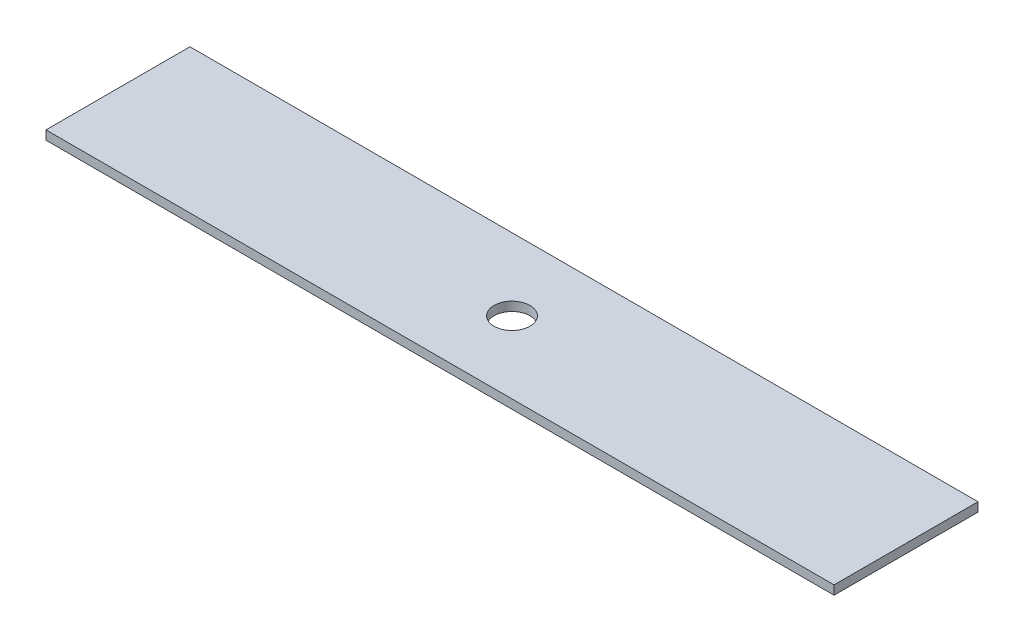
ISO-10303-21;
HEADER;
FILE_DESCRIPTION(('STEP AP214'),'2;1');
FILE_NAME('part.step','',(''),(''),'','','');
FILE_SCHEMA(('AUTOMOTIVE_DESIGN { 1 0 10303 214 1 1 1 1 }'));
ENDSEC;
DATA;
#1=APPLICATION_CONTEXT('core data for automotive mechanical design processes');
#2=APPLICATION_PROTOCOL_DEFINITION('international standard','automotive_design',2000,#1);
#3=PRODUCT_CONTEXT('',#1,'mechanical');
#4=PRODUCT('Part','Part','',(#3));
#5=PRODUCT_RELATED_PRODUCT_CATEGORY('part','',(#4));
#6=PRODUCT_DEFINITION_FORMATION('','',#4);
#7=PRODUCT_DEFINITION_CONTEXT('part definition',#1,'design');
#8=PRODUCT_DEFINITION('design','',#6,#7);
#9=PRODUCT_DEFINITION_SHAPE('','',#8);
#10=(LENGTH_UNIT() NAMED_UNIT(*) SI_UNIT(.MILLI.,.METRE.));
#11=(NAMED_UNIT(*) PLANE_ANGLE_UNIT() SI_UNIT($,.RADIAN.));
#12=(NAMED_UNIT(*) SI_UNIT($,.STERADIAN.) SOLID_ANGLE_UNIT());
#13=UNCERTAINTY_MEASURE_WITH_UNIT(LENGTH_MEASURE(1.E-05),#10,'distance_accuracy_value','');
#14=(GEOMETRIC_REPRESENTATION_CONTEXT(3) GLOBAL_UNCERTAINTY_ASSIGNED_CONTEXT((#13)) GLOBAL_UNIT_ASSIGNED_CONTEXT((#10,
#11,#12)) REPRESENTATION_CONTEXT('',''));
#15=CARTESIAN_POINT('',(0.,0.,0.));
#16=DIRECTION('',(0.,0.,1.));
#17=DIRECTION('',(1.,0.,0.));
#18=AXIS2_PLACEMENT_3D('',#15,#16,#17);
#19=CARTESIAN_POINT('',(139.065,3.175,-25.4));
#20=DIRECTION('',(-1.,0.,0.));
#21=DIRECTION('',(0.,0.,1.));
#22=AXIS2_PLACEMENT_3D('',#19,#20,#21);
#23=PLANE('',#22);
#24=DIRECTION('',(0.,0.,-1.));
#25=VECTOR('',#24,1.);
#26=CARTESIAN_POINT('',(139.065,0.,-25.4));
#27=LINE('',#26,#25);
#28=CARTESIAN_POINT('',(139.065,0.,25.4));
#29=VERTEX_POINT('',#28);
#30=CARTESIAN_POINT('',(139.065,0.,-25.4));
#31=VERTEX_POINT('',#30);
#32=EDGE_CURVE('E96',#29,#31,#27,.T.);
#33=ORIENTED_EDGE('',*,*,#32,.T.);
#34=DIRECTION('',(0.,-1.,0.));
#35=VECTOR('',#34,1.);
#36=CARTESIAN_POINT('',(139.065,3.175,-25.4));
#37=LINE('',#36,#35);
#38=CARTESIAN_POINT('',(139.065,3.175,-25.4));
#39=VERTEX_POINT('',#38);
#40=EDGE_CURVE('E11',#39,#31,#37,.T.);
#41=ORIENTED_EDGE('',*,*,#40,.F.);
#42=DIRECTION('',(0.,0.,-1.));
#43=VECTOR('',#42,1.);
#44=CARTESIAN_POINT('',(139.065,3.175,-25.4));
#45=LINE('',#44,#43);
#46=CARTESIAN_POINT('',(139.065,3.175,25.4));
#47=VERTEX_POINT('',#46);
#48=EDGE_CURVE('E84',#47,#39,#45,.T.);
#49=ORIENTED_EDGE('',*,*,#48,.F.);
#50=DIRECTION('',(0.,-1.,0.));
#51=VECTOR('',#50,1.);
#52=CARTESIAN_POINT('',(139.065,3.175,25.4));
#53=LINE('',#52,#51);
#54=EDGE_CURVE('E92',#47,#29,#53,.T.);
#55=ORIENTED_EDGE('',*,*,#54,.T.);
#56=EDGE_LOOP('',(#33,#41,#49,#55));
#57=FACE_BOUND('',#56,.T.);
#58=ADVANCED_FACE('F33',(#57),#23,.F.);
#59=CARTESIAN_POINT('',(-139.065,3.175,-25.4));
#60=DIRECTION('',(0.,0.,1.));
#61=DIRECTION('',(1.,0.,0.));
#62=AXIS2_PLACEMENT_3D('',#59,#60,#61);
#63=PLANE('',#62);
#64=DIRECTION('',(-1.,0.,0.));
#65=VECTOR('',#64,1.);
#66=CARTESIAN_POINT('',(-139.065,0.,-25.4));
#67=LINE('',#66,#65);
#68=CARTESIAN_POINT('',(-139.065,0.,-25.4));
#69=VERTEX_POINT('',#68);
#70=EDGE_CURVE('E88',#31,#69,#67,.T.);
#71=ORIENTED_EDGE('',*,*,#70,.T.);
#72=DIRECTION('',(0.,-1.,0.));
#73=VECTOR('',#72,1.);
#74=CARTESIAN_POINT('',(-139.065,3.175,-25.4));
#75=LINE('',#74,#73);
#76=CARTESIAN_POINT('',(-139.065,3.175,-25.4));
#77=VERTEX_POINT('',#76);
#78=EDGE_CURVE('E41',#77,#69,#75,.T.);
#79=ORIENTED_EDGE('',*,*,#78,.F.);
#80=DIRECTION('',(-1.,0.,0.));
#81=VECTOR('',#80,1.);
#82=CARTESIAN_POINT('',(-139.065,3.175,-25.4));
#83=LINE('',#82,#81);
#84=EDGE_CURVE('E79',#39,#77,#83,.T.);
#85=ORIENTED_EDGE('',*,*,#84,.F.);
#86=ORIENTED_EDGE('',*,*,#40,.T.);
#87=EDGE_LOOP('',(#71,#79,#85,#86));
#88=FACE_BOUND('',#87,.T.);
#89=ADVANCED_FACE('F87',(#88),#63,.F.);
#90=CARTESIAN_POINT('',(-139.065,3.175,-25.4));
#91=DIRECTION('',(1.,0.,0.));
#92=DIRECTION('',(0.,0.,-1.));
#93=AXIS2_PLACEMENT_3D('',#90,#91,#92);
#94=PLANE('',#93);
#95=DIRECTION('',(0.,0.,1.));
#96=VECTOR('',#95,1.);
#97=CARTESIAN_POINT('',(-139.065,0.,-25.4));
#98=LINE('',#97,#96);
#99=CARTESIAN_POINT('',(-139.065,0.,25.4));
#100=VERTEX_POINT('',#99);
#101=EDGE_CURVE('E66',#69,#100,#98,.T.);
#102=ORIENTED_EDGE('',*,*,#101,.T.);
#103=DIRECTION('',(0.,-1.,0.));
#104=VECTOR('',#103,1.);
#105=CARTESIAN_POINT('',(-139.065,3.175,25.4));
#106=LINE('',#105,#104);
#107=CARTESIAN_POINT('',(-139.065,3.175,25.4));
#108=VERTEX_POINT('',#107);
#109=EDGE_CURVE('E89',#108,#100,#106,.T.);
#110=ORIENTED_EDGE('',*,*,#109,.F.);
#111=DIRECTION('',(0.,0.,1.));
#112=VECTOR('',#111,1.);
#113=CARTESIAN_POINT('',(-139.065,3.175,-25.4));
#114=LINE('',#113,#112);
#115=EDGE_CURVE('E82',#77,#108,#114,.T.);
#116=ORIENTED_EDGE('',*,*,#115,.F.);
#117=ORIENTED_EDGE('',*,*,#78,.T.);
#118=EDGE_LOOP('',(#102,#110,#116,#117));
#119=FACE_BOUND('',#118,.T.);
#120=ADVANCED_FACE('F90',(#119),#94,.F.);
#121=CARTESIAN_POINT('',(-139.065,3.175,25.4));
#122=DIRECTION('',(0.,0.,-1.));
#123=DIRECTION('',(-1.,0.,0.));
#124=AXIS2_PLACEMENT_3D('',#121,#122,#123);
#125=PLANE('',#124);
#126=DIRECTION('',(1.,0.,0.));
#127=VECTOR('',#126,1.);
#128=CARTESIAN_POINT('',(-139.065,0.,25.4));
#129=LINE('',#128,#127);
#130=EDGE_CURVE('E72',#100,#29,#129,.T.);
#131=ORIENTED_EDGE('',*,*,#130,.T.);
#132=ORIENTED_EDGE('',*,*,#54,.F.);
#133=DIRECTION('',(1.,0.,0.));
#134=VECTOR('',#133,1.);
#135=CARTESIAN_POINT('',(-139.065,3.175,25.4));
#136=LINE('',#135,#134);
#137=EDGE_CURVE('E49',#108,#47,#136,.T.);
#138=ORIENTED_EDGE('',*,*,#137,.F.);
#139=ORIENTED_EDGE('',*,*,#109,.T.);
#140=EDGE_LOOP('',(#131,#132,#138,#139));
#141=FACE_BOUND('',#140,.T.);
#142=ADVANCED_FACE('F104',(#141),#125,.F.);
#143=CARTESIAN_POINT('',(0.,3.175,0.));
#144=DIRECTION('',(0.,1.,0.));
#145=DIRECTION('',(0.,0.,1.));
#146=AXIS2_PLACEMENT_3D('',#143,#144,#145);
#147=PLANE('',#146);
#148=CARTESIAN_POINT('',(0.,3.175,0.));
#149=DIRECTION('',(0.,1.,0.));
#150=DIRECTION('',(0.,0.,1.));
#151=AXIS2_PLACEMENT_3D('',#148,#149,#150);
#152=CIRCLE('',#151,6.35);
#153=CARTESIAN_POINT('',(0.,3.175,6.35));
#154=VERTEX_POINT('',#153);
#155=EDGE_CURVE('E110',#154,#154,#152,.T.);
#156=ORIENTED_EDGE('',*,*,#155,.F.);
#157=EDGE_LOOP('',(#156));
#158=FACE_BOUND('',#157,.T.);
#159=ORIENTED_EDGE('',*,*,#48,.T.);
#160=ORIENTED_EDGE('',*,*,#84,.T.);
#161=ORIENTED_EDGE('',*,*,#115,.T.);
#162=ORIENTED_EDGE('',*,*,#137,.T.);
#163=EDGE_LOOP('',(#159,#160,#161,#162));
#164=FACE_BOUND('',#163,.T.);
#165=ADVANCED_FACE('F80',(#158,#164),#147,.T.);
#166=CARTESIAN_POINT('',(0.,0.,0.));
#167=DIRECTION('',(0.,1.,0.));
#168=DIRECTION('',(0.,0.,1.));
#169=AXIS2_PLACEMENT_3D('',#166,#167,#168);
#170=PLANE('',#169);
#171=CARTESIAN_POINT('',(0.,0.,0.));
#172=DIRECTION('',(0.,1.,0.));
#173=DIRECTION('',(0.,0.,1.));
#174=AXIS2_PLACEMENT_3D('',#171,#172,#173);
#175=CIRCLE('',#174,6.35);
#176=CARTESIAN_POINT('',(0.,0.,6.35));
#177=VERTEX_POINT('',#176);
#178=EDGE_CURVE('E99',#177,#177,#175,.T.);
#179=ORIENTED_EDGE('',*,*,#178,.T.);
#180=EDGE_LOOP('',(#179));
#181=FACE_BOUND('',#180,.T.);
#182=ORIENTED_EDGE('',*,*,#32,.F.);
#183=ORIENTED_EDGE('',*,*,#130,.F.);
#184=ORIENTED_EDGE('',*,*,#101,.F.);
#185=ORIENTED_EDGE('',*,*,#70,.F.);
#186=EDGE_LOOP('',(#182,#183,#184,#185));
#187=FACE_BOUND('',#186,.T.);
#188=ADVANCED_FACE('F107',(#181,#187),#170,.F.);
#189=CARTESIAN_POINT('',(0.,0.,0.));
#190=DIRECTION('',(0.,1.,0.));
#191=DIRECTION('',(0.,0.,1.));
#192=AXIS2_PLACEMENT_3D('',#189,#190,#191);
#193=CYLINDRICAL_SURFACE('',#192,6.35);
#194=ORIENTED_EDGE('',*,*,#178,.F.);
#195=EDGE_LOOP('',(#194));
#196=FACE_BOUND('',#195,.T.);
#197=ORIENTED_EDGE('',*,*,#155,.T.);
#198=EDGE_LOOP('',(#197));
#199=FACE_BOUND('',#198,.T.);
#200=ADVANCED_FACE('F117',(#196,#199),#193,.F.);
#201=CLOSED_SHELL('',(#58,#89,#120,#142,#165,#188,#200));
#202=MANIFOLD_SOLID_BREP('B2',#201);
#203=ADVANCED_BREP_SHAPE_REPRESENTATION('',(#18,#202),#14);
#204=SHAPE_DEFINITION_REPRESENTATION(#9,#203);
ENDSEC;
END-ISO-10303-21;
